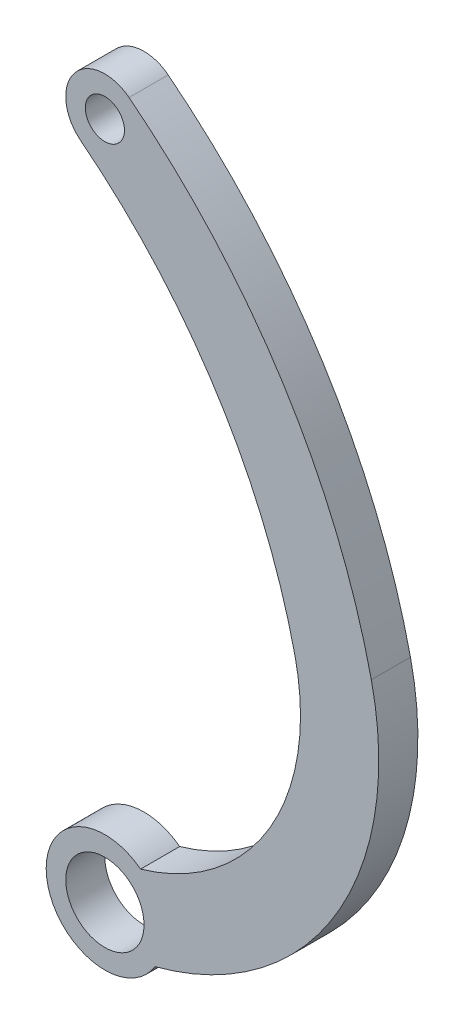
ISO-10303-21;
HEADER;
FILE_DESCRIPTION(('STEP AP214'),'2;1');
FILE_NAME('part.step','',(''),(''),'','','');
FILE_SCHEMA(('AUTOMOTIVE_DESIGN { 1 0 10303 214 1 1 1 1 }'));
ENDSEC;
DATA;
#1=APPLICATION_CONTEXT('core data for automotive mechanical design processes');
#2=APPLICATION_PROTOCOL_DEFINITION('international standard','automotive_design',2000,#1);
#3=PRODUCT_CONTEXT('',#1,'mechanical');
#4=PRODUCT('Part','Part','',(#3));
#5=PRODUCT_RELATED_PRODUCT_CATEGORY('part','',(#4));
#6=PRODUCT_DEFINITION_FORMATION('','',#4);
#7=PRODUCT_DEFINITION_CONTEXT('part definition',#1,'design');
#8=PRODUCT_DEFINITION('design','',#6,#7);
#9=PRODUCT_DEFINITION_SHAPE('','',#8);
#10=(LENGTH_UNIT() NAMED_UNIT(*) SI_UNIT(.MILLI.,.METRE.));
#11=(NAMED_UNIT(*) PLANE_ANGLE_UNIT() SI_UNIT($,.RADIAN.));
#12=(NAMED_UNIT(*) SI_UNIT($,.STERADIAN.) SOLID_ANGLE_UNIT());
#13=UNCERTAINTY_MEASURE_WITH_UNIT(LENGTH_MEASURE(1.E-05),#10,'distance_accuracy_value','');
#14=(GEOMETRIC_REPRESENTATION_CONTEXT(3) GLOBAL_UNCERTAINTY_ASSIGNED_CONTEXT((#13)) GLOBAL_UNIT_ASSIGNED_CONTEXT((#10,
#11,#12)) REPRESENTATION_CONTEXT('',''));
#15=CARTESIAN_POINT('',(0.,0.,0.));
#16=DIRECTION('',(0.,0.,1.));
#17=DIRECTION('',(1.,0.,0.));
#18=AXIS2_PLACEMENT_3D('',#15,#16,#17);
#19=CARTESIAN_POINT('',(-4.00734259147961,-12.2012411581151,6.));
#20=DIRECTION('',(0.,0.,-1.));
#21=DIRECTION('',(-1.,0.,0.));
#22=AXIS2_PLACEMENT_3D('',#19,#20,#21);
#23=CYLINDRICAL_SURFACE('',#22,46.);
#24=CARTESIAN_POINT('',(-4.00734259147961,-12.2012411581151,6.));
#25=DIRECTION('',(0.,0.,1.));
#26=DIRECTION('',(1.,0.,0.));
#27=AXIS2_PLACEMENT_3D('',#24,#25,#26);
#28=CIRCLE('',#27,46.);
#29=CARTESIAN_POINT('',(7.68038880554014,-56.691655123273,6.));
#30=VERTEX_POINT('',#29);
#31=CARTESIAN_POINT('',(40.8511013887219,-2.01693933250528,6.));
#32=VERTEX_POINT('',#31);
#33=EDGE_CURVE('E85',#30,#32,#28,.T.);
#34=ORIENTED_EDGE('',*,*,#33,.F.);
#35=DIRECTION('',(0.,0.,1.));
#36=VECTOR('',#35,1.);
#37=CARTESIAN_POINT('',(7.68038880554014,-56.691655123273,3.));
#38=LINE('',#37,#36);
#39=CARTESIAN_POINT('',(7.68038880554014,-56.691655123273,0.));
#40=VERTEX_POINT('',#39);
#41=EDGE_CURVE('E94',#30,#40,#38,.F.);
#42=ORIENTED_EDGE('',*,*,#41,.T.);
#43=CARTESIAN_POINT('',(-4.00734259147961,-12.2012411581151,0.));
#44=DIRECTION('',(0.,0.,1.));
#45=DIRECTION('',(1.,0.,0.));
#46=AXIS2_PLACEMENT_3D('',#43,#44,#45);
#47=CIRCLE('',#46,46.);
#48=CARTESIAN_POINT('',(40.8511013887219,-2.01693933250528,0.));
#49=VERTEX_POINT('',#48);
#50=EDGE_CURVE('E100',#40,#49,#47,.T.);
#51=ORIENTED_EDGE('',*,*,#50,.T.);
#52=DIRECTION('',(0.,0.,-1.));
#53=VECTOR('',#52,1.);
#54=CARTESIAN_POINT('',(40.8511013887219,-2.01693933250528,6.));
#55=LINE('',#54,#53);
#56=EDGE_CURVE('E11',#32,#49,#55,.T.);
#57=ORIENTED_EDGE('',*,*,#56,.F.);
#58=EDGE_LOOP('',(#34,#42,#51,#57));
#59=FACE_BOUND('',#58,.T.);
#60=ADVANCED_FACE('F35',(#59),#23,.T.);
#61=CARTESIAN_POINT('',(-60.567989349125,-25.0423173730144,6.));
#62=DIRECTION('',(0.,0.,-1.));
#63=DIRECTION('',(-1.,0.,0.));
#64=AXIS2_PLACEMENT_3D('',#61,#62,#63);
#65=CYLINDRICAL_SURFACE('',#64,104.);
#66=CARTESIAN_POINT('',(-60.567989349125,-25.0423173730144,0.));
#67=DIRECTION('',(0.,0.,1.));
#68=DIRECTION('',(-1.,0.,0.));
#69=AXIS2_PLACEMENT_3D('',#66,#67,#68);
#70=CIRCLE('',#69,104.);
#71=CARTESIAN_POINT('',(3.70824424586479,56.716876573858,0.));
#72=VERTEX_POINT('',#71);
#73=EDGE_CURVE('E123',#49,#72,#70,.T.);
#74=ORIENTED_EDGE('',*,*,#73,.T.);
#75=DIRECTION('',(0.,0.,-1.));
#76=VECTOR('',#75,1.);
#77=CARTESIAN_POINT('',(3.70824424586479,56.716876573858,6.));
#78=LINE('',#77,#76);
#79=CARTESIAN_POINT('',(3.70824424586479,56.716876573858,6.));
#80=VERTEX_POINT('',#79);
#81=EDGE_CURVE('E42',#80,#72,#78,.T.);
#82=ORIENTED_EDGE('',*,*,#81,.F.);
#83=CARTESIAN_POINT('',(-60.567989349125,-25.0423173730144,6.));
#84=DIRECTION('',(0.,0.,1.));
#85=DIRECTION('',(-1.,0.,0.));
#86=AXIS2_PLACEMENT_3D('',#83,#84,#85);
#87=CIRCLE('',#86,104.);
#88=EDGE_CURVE('E109',#32,#80,#87,.T.);
#89=ORIENTED_EDGE('',*,*,#88,.F.);
#90=ORIENTED_EDGE('',*,*,#56,.T.);
#91=EDGE_LOOP('',(#74,#82,#89,#90));
#92=FACE_BOUND('',#91,.T.);
#93=ADVANCED_FACE('F152',(#92),#65,.T.);
#94=CARTESIAN_POINT('',(0.,52.,6.));
#95=DIRECTION('',(0.,0.,-1.));
#96=DIRECTION('',(-1.,0.,0.));
#97=AXIS2_PLACEMENT_3D('',#94,#95,#96);
#98=CYLINDRICAL_SURFACE('',#97,6.);
#99=CARTESIAN_POINT('',(0.,52.,0.));
#100=DIRECTION('',(0.,0.,1.));
#101=DIRECTION('',(1.,0.,0.));
#102=AXIS2_PLACEMENT_3D('',#99,#100,#101);
#103=CIRCLE('',#102,6.);
#104=CARTESIAN_POINT('',(-3.7082442458648,47.283123426142,0.));
#105=VERTEX_POINT('',#104);
#106=EDGE_CURVE('E125',#72,#105,#103,.T.);
#107=ORIENTED_EDGE('',*,*,#106,.T.);
#108=DIRECTION('',(0.,0.,-1.));
#109=VECTOR('',#108,1.);
#110=CARTESIAN_POINT('',(-3.7082442458648,47.283123426142,6.));
#111=LINE('',#110,#109);
#112=CARTESIAN_POINT('',(-3.7082442458648,47.283123426142,6.));
#113=VERTEX_POINT('',#112);
#114=EDGE_CURVE('E129',#113,#105,#111,.T.);
#115=ORIENTED_EDGE('',*,*,#114,.F.);
#116=CARTESIAN_POINT('',(0.,52.,6.));
#117=DIRECTION('',(0.,0.,1.));
#118=DIRECTION('',(1.,0.,0.));
#119=AXIS2_PLACEMENT_3D('',#116,#117,#118);
#120=CIRCLE('',#119,6.);
#121=EDGE_CURVE('E112',#80,#113,#120,.T.);
#122=ORIENTED_EDGE('',*,*,#121,.F.);
#123=ORIENTED_EDGE('',*,*,#81,.T.);
#124=EDGE_LOOP('',(#107,#115,#122,#123));
#125=FACE_BOUND('',#124,.T.);
#126=ADVANCED_FACE('F135',(#125),#98,.T.);
#127=CARTESIAN_POINT('',(-60.567989349125,-25.0423173730144,6.));
#128=DIRECTION('',(0.,0.,-1.));
#129=DIRECTION('',(-1.,0.,0.));
#130=AXIS2_PLACEMENT_3D('',#127,#128,#129);
#131=CYLINDRICAL_SURFACE('',#130,92.);
#132=CARTESIAN_POINT('',(-60.567989349125,-25.0423173730144,0.));
#133=DIRECTION('',(0.,0.,-1.));
#134=DIRECTION('',(-1.,0.,0.));
#135=AXIS2_PLACEMENT_3D('',#132,#133,#134);
#136=CIRCLE('',#135,92.);
#137=CARTESIAN_POINT('',(29.1488986112781,-4.67371372179479,0.));
#138=VERTEX_POINT('',#137);
#139=EDGE_CURVE('E79',#105,#138,#136,.T.);
#140=ORIENTED_EDGE('',*,*,#139,.T.);
#141=DIRECTION('',(0.,0.,-1.));
#142=VECTOR('',#141,1.);
#143=CARTESIAN_POINT('',(29.1488986112781,-4.67371372179479,6.));
#144=LINE('',#143,#142);
#145=CARTESIAN_POINT('',(29.1488986112781,-4.67371372179479,6.));
#146=VERTEX_POINT('',#145);
#147=EDGE_CURVE('E121',#146,#138,#144,.T.);
#148=ORIENTED_EDGE('',*,*,#147,.F.);
#149=CARTESIAN_POINT('',(-60.567989349125,-25.0423173730144,6.));
#150=DIRECTION('',(0.,0.,-1.));
#151=DIRECTION('',(-1.,0.,0.));
#152=AXIS2_PLACEMENT_3D('',#149,#150,#151);
#153=CIRCLE('',#152,92.);
#154=EDGE_CURVE('E58',#113,#146,#153,.T.);
#155=ORIENTED_EDGE('',*,*,#154,.F.);
#156=ORIENTED_EDGE('',*,*,#114,.T.);
#157=EDGE_LOOP('',(#140,#148,#155,#156));
#158=FACE_BOUND('',#157,.T.);
#159=ADVANCED_FACE('F144',(#158),#131,.F.);
#160=CARTESIAN_POINT('',(-4.00734259147961,-12.2012411581151,6.));
#161=DIRECTION('',(0.,0.,-1.));
#162=DIRECTION('',(-1.,0.,0.));
#163=AXIS2_PLACEMENT_3D('',#160,#161,#162);
#164=CYLINDRICAL_SURFACE('',#163,34.);
#165=CARTESIAN_POINT('',(-4.00734259147961,-12.2012411581151,0.));
#166=DIRECTION('',(0.,0.,-1.));
#167=DIRECTION('',(1.,0.,0.));
#168=AXIS2_PLACEMENT_3D('',#165,#166,#167);
#169=CIRCLE('',#168,34.);
#170=CARTESIAN_POINT('',(5.47058451065001,-44.8534830083574,0.));
#171=VERTEX_POINT('',#170);
#172=EDGE_CURVE('E110',#138,#171,#169,.T.);
#173=ORIENTED_EDGE('',*,*,#172,.T.);
#174=DIRECTION('',(0.,0.,1.));
#175=VECTOR('',#174,1.);
#176=CARTESIAN_POINT('',(5.47058451065001,-44.8534830083574,3.));
#177=LINE('',#176,#175);
#178=CARTESIAN_POINT('',(5.47058451065001,-44.8534830083574,6.));
#179=VERTEX_POINT('',#178);
#180=EDGE_CURVE('E101',#171,#179,#177,.T.);
#181=ORIENTED_EDGE('',*,*,#180,.T.);
#182=CARTESIAN_POINT('',(-4.00734259147961,-12.2012411581151,6.));
#183=DIRECTION('',(0.,0.,-1.));
#184=DIRECTION('',(1.,0.,0.));
#185=AXIS2_PLACEMENT_3D('',#182,#183,#184);
#186=CIRCLE('',#185,34.);
#187=EDGE_CURVE('E105',#146,#179,#186,.T.);
#188=ORIENTED_EDGE('',*,*,#187,.F.);
#189=ORIENTED_EDGE('',*,*,#147,.T.);
#190=EDGE_LOOP('',(#173,#181,#188,#189));
#191=FACE_BOUND('',#190,.T.);
#192=ADVANCED_FACE('F143',(#191),#164,.F.);
#193=CARTESIAN_POINT('',(-2.00367129573981,-32.1006205790575,6.));
#194=DIRECTION('',(0.,0.,-1.));
#195=DIRECTION('',(-1.,0.,0.));
#196=AXIS2_PLACEMENT_3D('',#193,#194,#195);
#197=PLANE('',#196);
#198=CARTESIAN_POINT('',(0.,-52.,6.));
#199=DIRECTION('',(0.,0.,1.));
#200=DIRECTION('',(1.,0.,0.));
#201=AXIS2_PLACEMENT_3D('',#198,#199,#200);
#202=CIRCLE('',#201,6.);
#203=CARTESIAN_POINT('',(6.,-52.,6.));
#204=VERTEX_POINT('',#203);
#205=EDGE_CURVE('E233',#204,#204,#202,.T.);
#206=ORIENTED_EDGE('',*,*,#205,.F.);
#207=EDGE_LOOP('',(#206));
#208=FACE_BOUND('',#207,.T.);
#209=CARTESIAN_POINT('',(0.,52.,6.));
#210=DIRECTION('',(0.,0.,1.));
#211=DIRECTION('',(1.,0.,0.));
#212=AXIS2_PLACEMENT_3D('',#209,#210,#211);
#213=CIRCLE('',#212,3.);
#214=CARTESIAN_POINT('',(3.,52.,6.));
#215=VERTEX_POINT('',#214);
#216=EDGE_CURVE('E240',#215,#215,#213,.T.);
#217=ORIENTED_EDGE('',*,*,#216,.F.);
#218=EDGE_LOOP('',(#217));
#219=FACE_BOUND('',#218,.T.);
#220=CARTESIAN_POINT('',(0.,-52.,6.));
#221=DIRECTION('',(0.,0.,1.));
#222=DIRECTION('',(1.,0.,0.));
#223=AXIS2_PLACEMENT_3D('',#220,#221,#222);
#224=CIRCLE('',#223,9.);
#225=EDGE_CURVE('E49',#179,#30,#224,.T.);
#226=ORIENTED_EDGE('',*,*,#225,.T.);
#227=ORIENTED_EDGE('',*,*,#33,.T.);
#228=ORIENTED_EDGE('',*,*,#88,.T.);
#229=ORIENTED_EDGE('',*,*,#121,.T.);
#230=ORIENTED_EDGE('',*,*,#154,.T.);
#231=ORIENTED_EDGE('',*,*,#187,.T.);
#232=EDGE_LOOP('',(#226,#227,#228,#229,#230,#231));
#233=FACE_BOUND('',#232,.T.);
#234=ADVANCED_FACE('F103',(#208,#219,#233),#197,.F.);
#235=CARTESIAN_POINT('',(-2.00367129573981,-32.1006205790575,0.));
#236=DIRECTION('',(0.,0.,-1.));
#237=DIRECTION('',(-1.,0.,0.));
#238=AXIS2_PLACEMENT_3D('',#235,#236,#237);
#239=PLANE('',#238);
#240=CARTESIAN_POINT('',(0.,-52.,0.));
#241=DIRECTION('',(0.,0.,-1.));
#242=DIRECTION('',(-1.,0.,0.));
#243=AXIS2_PLACEMENT_3D('',#240,#241,#242);
#244=CIRCLE('',#243,6.);
#245=CARTESIAN_POINT('',(-6.,-52.,0.));
#246=VERTEX_POINT('',#245);
#247=EDGE_CURVE('E106',#246,#246,#244,.F.);
#248=ORIENTED_EDGE('',*,*,#247,.T.);
#249=EDGE_LOOP('',(#248));
#250=FACE_BOUND('',#249,.T.);
#251=CARTESIAN_POINT('',(0.,52.,0.));
#252=DIRECTION('',(0.,0.,-1.));
#253=DIRECTION('',(-1.,0.,0.));
#254=AXIS2_PLACEMENT_3D('',#251,#252,#253);
#255=CIRCLE('',#254,3.);
#256=CARTESIAN_POINT('',(-3.,52.,0.));
#257=VERTEX_POINT('',#256);
#258=EDGE_CURVE('E237',#257,#257,#255,.F.);
#259=ORIENTED_EDGE('',*,*,#258,.T.);
#260=EDGE_LOOP('',(#259));
#261=FACE_BOUND('',#260,.T.);
#262=ORIENTED_EDGE('',*,*,#50,.F.);
#263=CARTESIAN_POINT('',(0.,-52.,0.));
#264=DIRECTION('',(0.,0.,-1.));
#265=DIRECTION('',(-1.,0.,0.));
#266=AXIS2_PLACEMENT_3D('',#263,#264,#265);
#267=CIRCLE('',#266,9.);
#268=EDGE_CURVE('E97',#171,#40,#267,.F.);
#269=ORIENTED_EDGE('',*,*,#268,.F.);
#270=ORIENTED_EDGE('',*,*,#172,.F.);
#271=ORIENTED_EDGE('',*,*,#139,.F.);
#272=ORIENTED_EDGE('',*,*,#106,.F.);
#273=ORIENTED_EDGE('',*,*,#73,.F.);
#274=EDGE_LOOP('',(#262,#269,#270,#271,#272,#273));
#275=FACE_BOUND('',#274,.T.);
#276=ADVANCED_FACE('F140',(#250,#261,#275),#239,.T.);
#277=CARTESIAN_POINT('',(0.,-52.,-25.4558441227157));
#278=DIRECTION('',(0.,0.,1.));
#279=DIRECTION('',(1.,0.,0.));
#280=AXIS2_PLACEMENT_3D('',#277,#278,#279);
#281=CYLINDRICAL_SURFACE('',#280,9.);
#282=ORIENTED_EDGE('',*,*,#41,.F.);
#283=ORIENTED_EDGE('',*,*,#225,.F.);
#284=ORIENTED_EDGE('',*,*,#180,.F.);
#285=ORIENTED_EDGE('',*,*,#268,.T.);
#286=EDGE_LOOP('',(#282,#283,#284,#285));
#287=FACE_BOUND('',#286,.T.);
#288=ADVANCED_FACE('F95',(#287),#281,.T.);
#289=CARTESIAN_POINT('',(0.,52.,-16.9705627484771));
#290=DIRECTION('',(0.,0.,1.));
#291=DIRECTION('',(1.,0.,0.));
#292=AXIS2_PLACEMENT_3D('',#289,#290,#291);
#293=CYLINDRICAL_SURFACE('',#292,3.);
#294=ORIENTED_EDGE('',*,*,#216,.T.);
#295=EDGE_LOOP('',(#294));
#296=FACE_BOUND('',#295,.T.);
#297=ORIENTED_EDGE('',*,*,#258,.F.);
#298=EDGE_LOOP('',(#297));
#299=FACE_BOUND('',#298,.T.);
#300=ADVANCED_FACE('F189',(#296,#299),#293,.F.);
#301=CARTESIAN_POINT('',(0.,-52.,-16.9705627484771));
#302=DIRECTION('',(0.,0.,1.));
#303=DIRECTION('',(1.,0.,0.));
#304=AXIS2_PLACEMENT_3D('',#301,#302,#303);
#305=CYLINDRICAL_SURFACE('',#304,6.);
#306=ORIENTED_EDGE('',*,*,#205,.T.);
#307=EDGE_LOOP('',(#306));
#308=FACE_BOUND('',#307,.T.);
#309=ORIENTED_EDGE('',*,*,#247,.F.);
#310=EDGE_LOOP('',(#309));
#311=FACE_BOUND('',#310,.T.);
#312=ADVANCED_FACE('F216',(#308,#311),#305,.F.);
#313=CLOSED_SHELL('',(#60,#93,#126,#159,#192,#234,#276,#288,#300,#312));
#314=MANIFOLD_SOLID_BREP('B2',#313);
#315=ADVANCED_BREP_SHAPE_REPRESENTATION('',(#18,#314),#14);
#316=SHAPE_DEFINITION_REPRESENTATION(#9,#315);
ENDSEC;
END-ISO-10303-21;
